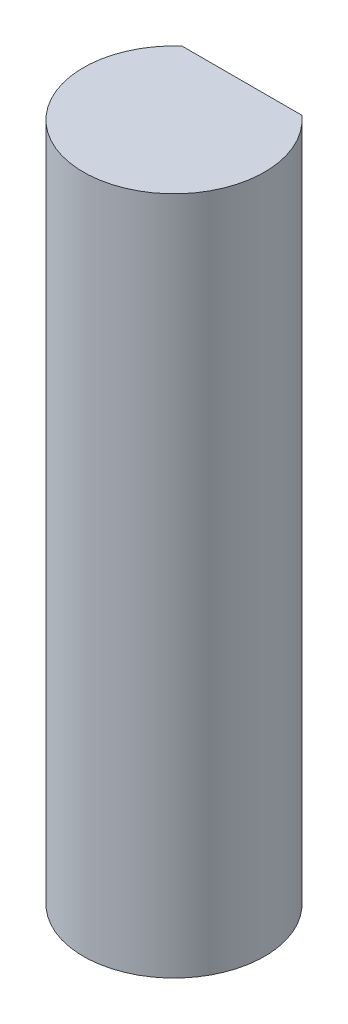
ISO-10303-21;
HEADER;
FILE_DESCRIPTION(('STEP AP214'),'2;1');
FILE_NAME('part.step','',(''),(''),'','','');
FILE_SCHEMA(('AUTOMOTIVE_DESIGN { 1 0 10303 214 1 1 1 1 }'));
ENDSEC;
DATA;
#1=APPLICATION_CONTEXT('core data for automotive mechanical design processes');
#2=APPLICATION_PROTOCOL_DEFINITION('international standard','automotive_design',2000,#1);
#3=PRODUCT_CONTEXT('',#1,'mechanical');
#4=PRODUCT('Part','Part','',(#3));
#5=PRODUCT_RELATED_PRODUCT_CATEGORY('part','',(#4));
#6=PRODUCT_DEFINITION_FORMATION('','',#4);
#7=PRODUCT_DEFINITION_CONTEXT('part definition',#1,'design');
#8=PRODUCT_DEFINITION('design','',#6,#7);
#9=PRODUCT_DEFINITION_SHAPE('','',#8);
#10=(LENGTH_UNIT() NAMED_UNIT(*) SI_UNIT(.MILLI.,.METRE.));
#11=(NAMED_UNIT(*) PLANE_ANGLE_UNIT() SI_UNIT($,.RADIAN.));
#12=(NAMED_UNIT(*) SI_UNIT($,.STERADIAN.) SOLID_ANGLE_UNIT());
#13=UNCERTAINTY_MEASURE_WITH_UNIT(LENGTH_MEASURE(1.E-05),#10,'distance_accuracy_value','');
#14=(GEOMETRIC_REPRESENTATION_CONTEXT(3) GLOBAL_UNCERTAINTY_ASSIGNED_CONTEXT((#13)) GLOBAL_UNIT_ASSIGNED_CONTEXT((#10,
#11,#12)) REPRESENTATION_CONTEXT('',''));
#15=CARTESIAN_POINT('',(0.,0.,0.));
#16=DIRECTION('',(0.,0.,1.));
#17=DIRECTION('',(1.,0.,0.));
#18=AXIS2_PLACEMENT_3D('',#15,#16,#17);
#19=CARTESIAN_POINT('',(0.,7.5,0.));
#20=DIRECTION('',(0.,-1.,0.));
#21=DIRECTION('',(0.,0.,-1.));
#22=AXIS2_PLACEMENT_3D('',#19,#20,#21);
#23=CYLINDRICAL_SURFACE('',#22,2.);
#24=CARTESIAN_POINT('',(0.,-7.5,0.));
#25=DIRECTION('',(0.,1.,0.));
#26=DIRECTION('',(0.,0.,1.));
#27=AXIS2_PLACEMENT_3D('',#24,#25,#26);
#28=CIRCLE('',#27,2.);
#29=CARTESIAN_POINT('',(-1.3228756555323,-7.5,-1.5));
#30=VERTEX_POINT('',#29);
#31=CARTESIAN_POINT('',(1.3228756555323,-7.5,-1.5));
#32=VERTEX_POINT('',#31);
#33=EDGE_CURVE('E67',#30,#32,#28,.T.);
#34=ORIENTED_EDGE('',*,*,#33,.T.);
#35=DIRECTION('',(0.,-1.,0.));
#36=VECTOR('',#35,1.);
#37=CARTESIAN_POINT('',(1.3228756555323,7.5,-1.5));
#38=LINE('',#37,#36);
#39=CARTESIAN_POINT('',(1.3228756555323,7.5,-1.5));
#40=VERTEX_POINT('',#39);
#41=EDGE_CURVE('E11',#40,#32,#38,.T.);
#42=ORIENTED_EDGE('',*,*,#41,.F.);
#43=CARTESIAN_POINT('',(0.,7.5,0.));
#44=DIRECTION('',(0.,1.,0.));
#45=DIRECTION('',(0.,0.,1.));
#46=AXIS2_PLACEMENT_3D('',#43,#44,#45);
#47=CIRCLE('',#46,2.);
#48=CARTESIAN_POINT('',(-1.3228756555323,7.5,-1.5));
#49=VERTEX_POINT('',#48);
#50=EDGE_CURVE('E66',#49,#40,#47,.T.);
#51=ORIENTED_EDGE('',*,*,#50,.F.);
#52=DIRECTION('',(0.,-1.,0.));
#53=VECTOR('',#52,1.);
#54=CARTESIAN_POINT('',(-1.3228756555323,7.5,-1.5));
#55=LINE('',#54,#53);
#56=EDGE_CURVE('E44',#49,#30,#55,.T.);
#57=ORIENTED_EDGE('',*,*,#56,.T.);
#58=EDGE_LOOP('',(#34,#42,#51,#57));
#59=FACE_BOUND('',#58,.T.);
#60=ADVANCED_FACE('F36',(#59),#23,.T.);
#61=CARTESIAN_POINT('',(1.3228756555323,7.5,-1.5));
#62=DIRECTION('',(0.,0.,1.));
#63=DIRECTION('',(1.,0.,0.));
#64=AXIS2_PLACEMENT_3D('',#61,#62,#63);
#65=PLANE('',#64);
#66=DIRECTION('',(-1.,0.,0.));
#67=VECTOR('',#66,1.);
#68=CARTESIAN_POINT('',(1.3228756555323,-7.5,-1.5));
#69=LINE('',#68,#67);
#70=EDGE_CURVE('E59',#32,#30,#69,.T.);
#71=ORIENTED_EDGE('',*,*,#70,.T.);
#72=ORIENTED_EDGE('',*,*,#56,.F.);
#73=DIRECTION('',(-1.,0.,0.));
#74=VECTOR('',#73,1.);
#75=CARTESIAN_POINT('',(1.3228756555323,7.5,-1.5));
#76=LINE('',#75,#74);
#77=EDGE_CURVE('E51',#40,#49,#76,.T.);
#78=ORIENTED_EDGE('',*,*,#77,.F.);
#79=ORIENTED_EDGE('',*,*,#41,.T.);
#80=EDGE_LOOP('',(#71,#72,#78,#79));
#81=FACE_BOUND('',#80,.T.);
#82=ADVANCED_FACE('F62',(#81),#65,.F.);
#83=CARTESIAN_POINT('',(0.,7.5,0.));
#84=DIRECTION('',(0.,1.,0.));
#85=DIRECTION('',(0.,0.,1.));
#86=AXIS2_PLACEMENT_3D('',#83,#84,#85);
#87=PLANE('',#86);
#88=ORIENTED_EDGE('',*,*,#50,.T.);
#89=ORIENTED_EDGE('',*,*,#77,.T.);
#90=EDGE_LOOP('',(#88,#89));
#91=FACE_BOUND('',#90,.T.);
#92=ADVANCED_FACE('F74',(#91),#87,.T.);
#93=CARTESIAN_POINT('',(0.,-7.5,0.));
#94=DIRECTION('',(0.,1.,0.));
#95=DIRECTION('',(0.,0.,1.));
#96=AXIS2_PLACEMENT_3D('',#93,#94,#95);
#97=PLANE('',#96);
#98=ORIENTED_EDGE('',*,*,#33,.F.);
#99=ORIENTED_EDGE('',*,*,#70,.F.);
#100=EDGE_LOOP('',(#98,#99));
#101=FACE_BOUND('',#100,.T.);
#102=ADVANCED_FACE('F70',(#101),#97,.F.);
#103=CLOSED_SHELL('',(#60,#82,#92,#102));
#104=MANIFOLD_SOLID_BREP('B2',#103);
#105=ADVANCED_BREP_SHAPE_REPRESENTATION('',(#18,#104),#14);
#106=SHAPE_DEFINITION_REPRESENTATION(#9,#105);
ENDSEC;
END-ISO-10303-21;
